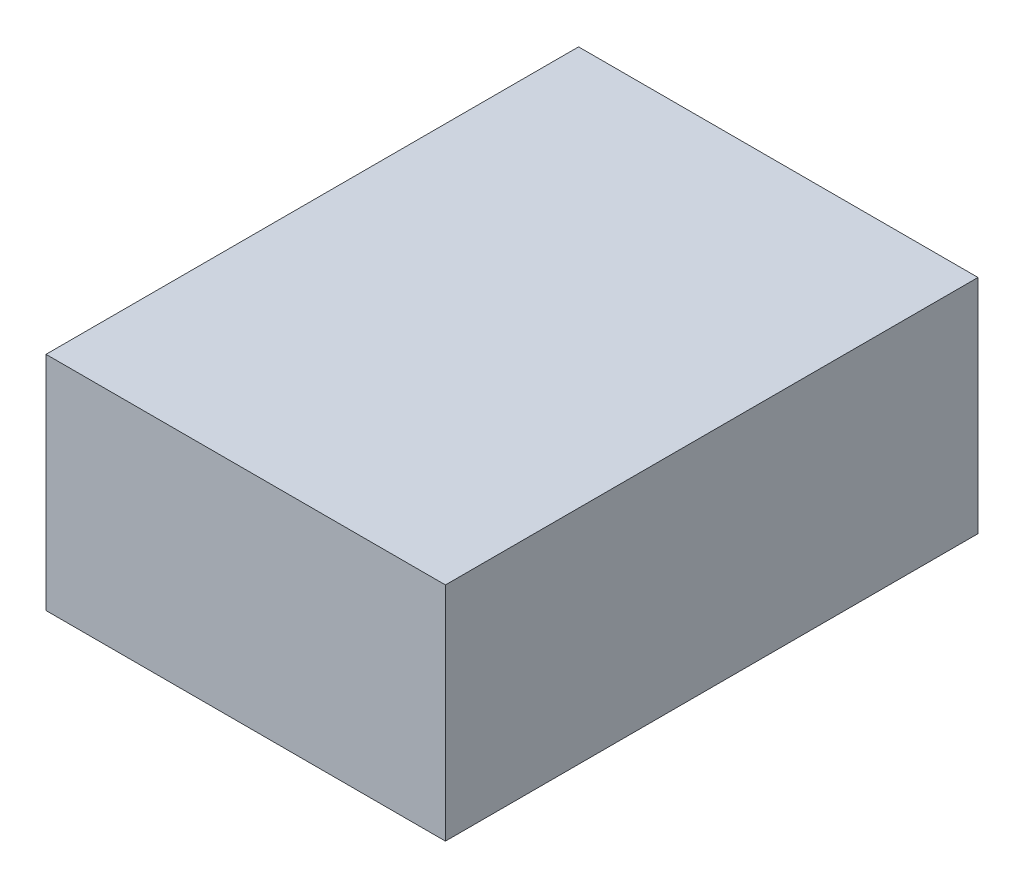
ISO-10303-21;
HEADER;
FILE_DESCRIPTION(('STEP AP214'),'2;1');
FILE_NAME('part.step','',(''),(''),'','','');
FILE_SCHEMA(('AUTOMOTIVE_DESIGN { 1 0 10303 214 1 1 1 1 }'));
ENDSEC;
DATA;
#1=APPLICATION_CONTEXT('core data for automotive mechanical design processes');
#2=APPLICATION_PROTOCOL_DEFINITION('international standard','automotive_design',2000,#1);
#3=PRODUCT_CONTEXT('',#1,'mechanical');
#4=PRODUCT('Part','Part','',(#3));
#5=PRODUCT_RELATED_PRODUCT_CATEGORY('part','',(#4));
#6=PRODUCT_DEFINITION_FORMATION('','',#4);
#7=PRODUCT_DEFINITION_CONTEXT('part definition',#1,'design');
#8=PRODUCT_DEFINITION('design','',#6,#7);
#9=PRODUCT_DEFINITION_SHAPE('','',#8);
#10=(LENGTH_UNIT() NAMED_UNIT(*) SI_UNIT(.MILLI.,.METRE.));
#11=(NAMED_UNIT(*) PLANE_ANGLE_UNIT() SI_UNIT($,.RADIAN.));
#12=(NAMED_UNIT(*) SI_UNIT($,.STERADIAN.) SOLID_ANGLE_UNIT());
#13=UNCERTAINTY_MEASURE_WITH_UNIT(LENGTH_MEASURE(1.E-05),#10,'distance_accuracy_value','');
#14=(GEOMETRIC_REPRESENTATION_CONTEXT(3) GLOBAL_UNCERTAINTY_ASSIGNED_CONTEXT((#13)) GLOBAL_UNIT_ASSIGNED_CONTEXT((#10,
#11,#12)) REPRESENTATION_CONTEXT('',''));
#15=CARTESIAN_POINT('',(0.,0.,0.));
#16=DIRECTION('',(0.,0.,1.));
#17=DIRECTION('',(1.,0.,0.));
#18=AXIS2_PLACEMENT_3D('',#15,#16,#17);
#19=CARTESIAN_POINT('',(22.5,-12.5,60.));
#20=DIRECTION('',(-1.,0.,0.));
#21=DIRECTION('',(0.,0.,1.));
#22=AXIS2_PLACEMENT_3D('',#19,#20,#21);
#23=PLANE('',#22);
#24=DIRECTION('',(0.,1.,0.));
#25=VECTOR('',#24,1.);
#26=CARTESIAN_POINT('',(22.5,-12.5,0.));
#27=LINE('',#26,#25);
#28=CARTESIAN_POINT('',(22.5,-12.5,0.));
#29=VERTEX_POINT('',#28);
#30=CARTESIAN_POINT('',(22.5,12.5,0.));
#31=VERTEX_POINT('',#30);
#32=EDGE_CURVE('E164',#29,#31,#27,.T.);
#33=ORIENTED_EDGE('',*,*,#32,.T.);
#34=DIRECTION('',(0.,0.,-1.));
#35=VECTOR('',#34,1.);
#36=CARTESIAN_POINT('',(22.5,12.5,60.));
#37=LINE('',#36,#35);
#38=CARTESIAN_POINT('',(22.5,12.5,60.));
#39=VERTEX_POINT('',#38);
#40=EDGE_CURVE('E11',#39,#31,#37,.T.);
#41=ORIENTED_EDGE('',*,*,#40,.F.);
#42=DIRECTION('',(0.,1.,0.));
#43=VECTOR('',#42,1.);
#44=CARTESIAN_POINT('',(22.5,-12.5,60.));
#45=LINE('',#44,#43);
#46=CARTESIAN_POINT('',(22.5,-12.5,60.));
#47=VERTEX_POINT('',#46);
#48=EDGE_CURVE('E170',#47,#39,#45,.T.);
#49=ORIENTED_EDGE('',*,*,#48,.F.);
#50=DIRECTION('',(0.,0.,-1.));
#51=VECTOR('',#50,1.);
#52=CARTESIAN_POINT('',(22.5,-12.5,60.));
#53=LINE('',#52,#51);
#54=EDGE_CURVE('E180',#47,#29,#53,.T.);
#55=ORIENTED_EDGE('',*,*,#54,.T.);
#56=EDGE_LOOP('',(#33,#41,#49,#55));
#57=FACE_BOUND('',#56,.T.);
#58=ADVANCED_FACE('F45',(#57),#23,.F.);
#59=CARTESIAN_POINT('',(-22.5,12.5,60.));
#60=DIRECTION('',(0.,-1.,0.));
#61=DIRECTION('',(0.,0.,-1.));
#62=AXIS2_PLACEMENT_3D('',#59,#60,#61);
#63=PLANE('',#62);
#64=DIRECTION('',(-1.,0.,0.));
#65=VECTOR('',#64,1.);
#66=CARTESIAN_POINT('',(-22.5,12.5,0.));
#67=LINE('',#66,#65);
#68=CARTESIAN_POINT('',(-22.5,12.5,0.));
#69=VERTEX_POINT('',#68);
#70=EDGE_CURVE('E184',#31,#69,#67,.T.);
#71=ORIENTED_EDGE('',*,*,#70,.T.);
#72=DIRECTION('',(0.,0.,-1.));
#73=VECTOR('',#72,1.);
#74=CARTESIAN_POINT('',(-22.5,12.5,60.));
#75=LINE('',#74,#73);
#76=CARTESIAN_POINT('',(-22.5,12.5,60.));
#77=VERTEX_POINT('',#76);
#78=EDGE_CURVE('E53',#77,#69,#75,.T.);
#79=ORIENTED_EDGE('',*,*,#78,.F.);
#80=DIRECTION('',(-1.,0.,0.));
#81=VECTOR('',#80,1.);
#82=CARTESIAN_POINT('',(-22.5,12.5,60.));
#83=LINE('',#82,#81);
#84=EDGE_CURVE('E97',#39,#77,#83,.T.);
#85=ORIENTED_EDGE('',*,*,#84,.F.);
#86=ORIENTED_EDGE('',*,*,#40,.T.);
#87=EDGE_LOOP('',(#71,#79,#85,#86));
#88=FACE_BOUND('',#87,.T.);
#89=ADVANCED_FACE('F218',(#88),#63,.F.);
#90=CARTESIAN_POINT('',(-22.5,-12.5,60.));
#91=DIRECTION('',(1.,0.,0.));
#92=DIRECTION('',(0.,0.,-1.));
#93=AXIS2_PLACEMENT_3D('',#90,#91,#92);
#94=PLANE('',#93);
#95=DIRECTION('',(0.,-1.,0.));
#96=VECTOR('',#95,1.);
#97=CARTESIAN_POINT('',(-22.5,-12.5,0.));
#98=LINE('',#97,#96);
#99=CARTESIAN_POINT('',(-22.5,-12.5,0.));
#100=VERTEX_POINT('',#99);
#101=EDGE_CURVE('E187',#69,#100,#98,.T.);
#102=ORIENTED_EDGE('',*,*,#101,.T.);
#103=DIRECTION('',(0.,0.,-1.));
#104=VECTOR('',#103,1.);
#105=CARTESIAN_POINT('',(-22.5,-12.5,60.));
#106=LINE('',#105,#104);
#107=CARTESIAN_POINT('',(-22.5,-12.5,60.));
#108=VERTEX_POINT('',#107);
#109=EDGE_CURVE('E194',#108,#100,#106,.T.);
#110=ORIENTED_EDGE('',*,*,#109,.F.);
#111=DIRECTION('',(0.,-1.,0.));
#112=VECTOR('',#111,1.);
#113=CARTESIAN_POINT('',(-22.5,-12.5,60.));
#114=LINE('',#113,#112);
#115=EDGE_CURVE('E175',#77,#108,#114,.T.);
#116=ORIENTED_EDGE('',*,*,#115,.F.);
#117=ORIENTED_EDGE('',*,*,#78,.T.);
#118=EDGE_LOOP('',(#102,#110,#116,#117));
#119=FACE_BOUND('',#118,.T.);
#120=ADVANCED_FACE('F201',(#119),#94,.F.);
#121=CARTESIAN_POINT('',(-22.5,-12.5,60.));
#122=DIRECTION('',(0.,1.,0.));
#123=DIRECTION('',(0.,0.,1.));
#124=AXIS2_PLACEMENT_3D('',#121,#122,#123);
#125=PLANE('',#124);
#126=DIRECTION('',(1.,0.,0.));
#127=VECTOR('',#126,1.);
#128=CARTESIAN_POINT('',(-22.5,-12.5,0.));
#129=LINE('',#128,#127);
#130=EDGE_CURVE('E90',#100,#29,#129,.T.);
#131=ORIENTED_EDGE('',*,*,#130,.T.);
#132=ORIENTED_EDGE('',*,*,#54,.F.);
#133=DIRECTION('',(1.,0.,0.));
#134=VECTOR('',#133,1.);
#135=CARTESIAN_POINT('',(-22.5,-12.5,60.));
#136=LINE('',#135,#134);
#137=EDGE_CURVE('E69',#108,#47,#136,.T.);
#138=ORIENTED_EDGE('',*,*,#137,.F.);
#139=ORIENTED_EDGE('',*,*,#109,.T.);
#140=EDGE_LOOP('',(#131,#132,#138,#139));
#141=FACE_BOUND('',#140,.T.);
#142=ADVANCED_FACE('F209',(#141),#125,.F.);
#143=CARTESIAN_POINT('',(0.,0.,60.));
#144=DIRECTION('',(0.,0.,-1.));
#145=DIRECTION('',(-1.,0.,0.));
#146=AXIS2_PLACEMENT_3D('',#143,#144,#145);
#147=PLANE('',#146);
#148=ORIENTED_EDGE('',*,*,#48,.T.);
#149=ORIENTED_EDGE('',*,*,#84,.T.);
#150=ORIENTED_EDGE('',*,*,#115,.T.);
#151=ORIENTED_EDGE('',*,*,#137,.T.);
#152=EDGE_LOOP('',(#148,#149,#150,#151));
#153=FACE_BOUND('',#152,.T.);
#154=ADVANCED_FACE('F211',(#153),#147,.F.);
#155=CARTESIAN_POINT('',(0.,0.,0.));
#156=DIRECTION('',(0.,0.,-1.));
#157=DIRECTION('',(-1.,0.,0.));
#158=AXIS2_PLACEMENT_3D('',#155,#156,#157);
#159=PLANE('',#158);
#160=DIRECTION('',(0.,1.,0.));
#161=VECTOR('',#160,1.);
#162=CARTESIAN_POINT('',(-21.,-11.,0.));
#163=LINE('',#162,#161);
#164=CARTESIAN_POINT('',(-21.,-11.,0.));
#165=VERTEX_POINT('',#164);
#166=CARTESIAN_POINT('',(-21.,11.,0.));
#167=VERTEX_POINT('',#166);
#168=EDGE_CURVE('E60',#165,#167,#163,.T.);
#169=ORIENTED_EDGE('',*,*,#168,.F.);
#170=DIRECTION('',(-1.,0.,0.));
#171=VECTOR('',#170,1.);
#172=CARTESIAN_POINT('',(21.,-11.,0.));
#173=LINE('',#172,#171);
#174=CARTESIAN_POINT('',(21.,-11.,0.));
#175=VERTEX_POINT('',#174);
#176=EDGE_CURVE('E142',#175,#165,#173,.T.);
#177=ORIENTED_EDGE('',*,*,#176,.F.);
#178=DIRECTION('',(0.,-1.,0.));
#179=VECTOR('',#178,1.);
#180=CARTESIAN_POINT('',(21.,-11.,0.));
#181=LINE('',#180,#179);
#182=CARTESIAN_POINT('',(21.,11.,0.));
#183=VERTEX_POINT('',#182);
#184=EDGE_CURVE('E146',#183,#175,#181,.T.);
#185=ORIENTED_EDGE('',*,*,#184,.F.);
#186=DIRECTION('',(1.,0.,0.));
#187=VECTOR('',#186,1.);
#188=CARTESIAN_POINT('',(21.,11.,0.));
#189=LINE('',#188,#187);
#190=EDGE_CURVE('E155',#167,#183,#189,.T.);
#191=ORIENTED_EDGE('',*,*,#190,.F.);
#192=EDGE_LOOP('',(#169,#177,#185,#191));
#193=FACE_BOUND('',#192,.T.);
#194=ORIENTED_EDGE('',*,*,#32,.F.);
#195=ORIENTED_EDGE('',*,*,#130,.F.);
#196=ORIENTED_EDGE('',*,*,#101,.F.);
#197=ORIENTED_EDGE('',*,*,#70,.F.);
#198=EDGE_LOOP('',(#194,#195,#196,#197));
#199=FACE_BOUND('',#198,.T.);
#200=ADVANCED_FACE('F205',(#193,#199),#159,.T.);
#201=CARTESIAN_POINT('',(-21.,-11.,11.));
#202=DIRECTION('',(-1.,0.,0.));
#203=DIRECTION('',(0.,0.,1.));
#204=AXIS2_PLACEMENT_3D('',#201,#202,#203);
#205=PLANE('',#204);
#206=ORIENTED_EDGE('',*,*,#168,.T.);
#207=DIRECTION('',(0.,0.,-1.));
#208=VECTOR('',#207,1.);
#209=CARTESIAN_POINT('',(-21.,11.,11.));
#210=LINE('',#209,#208);
#211=CARTESIAN_POINT('',(-21.,11.,11.));
#212=VERTEX_POINT('',#211);
#213=EDGE_CURVE('E117',#212,#167,#210,.T.);
#214=ORIENTED_EDGE('',*,*,#213,.F.);
#215=DIRECTION('',(0.,1.,0.));
#216=VECTOR('',#215,1.);
#217=CARTESIAN_POINT('',(-21.,-11.,11.));
#218=LINE('',#217,#216);
#219=CARTESIAN_POINT('',(-21.,-11.,11.));
#220=VERTEX_POINT('',#219);
#221=EDGE_CURVE('E121',#220,#212,#218,.T.);
#222=ORIENTED_EDGE('',*,*,#221,.F.);
#223=DIRECTION('',(0.,0.,-1.));
#224=VECTOR('',#223,1.);
#225=CARTESIAN_POINT('',(-21.,-11.,11.));
#226=LINE('',#225,#224);
#227=EDGE_CURVE('E161',#220,#165,#226,.T.);
#228=ORIENTED_EDGE('',*,*,#227,.T.);
#229=EDGE_LOOP('',(#206,#214,#222,#228));
#230=FACE_BOUND('',#229,.T.);
#231=ADVANCED_FACE('F119',(#230),#205,.F.);
#232=CARTESIAN_POINT('',(21.,-11.,11.));
#233=DIRECTION('',(0.,-1.,0.));
#234=DIRECTION('',(0.,0.,-1.));
#235=AXIS2_PLACEMENT_3D('',#232,#233,#234);
#236=PLANE('',#235);
#237=ORIENTED_EDGE('',*,*,#176,.T.);
#238=ORIENTED_EDGE('',*,*,#227,.F.);
#239=DIRECTION('',(-1.,0.,0.));
#240=VECTOR('',#239,1.);
#241=CARTESIAN_POINT('',(21.,-11.,11.));
#242=LINE('',#241,#240);
#243=CARTESIAN_POINT('',(21.,-11.,11.));
#244=VERTEX_POINT('',#243);
#245=EDGE_CURVE('E128',#244,#220,#242,.T.);
#246=ORIENTED_EDGE('',*,*,#245,.F.);
#247=DIRECTION('',(0.,0.,-1.));
#248=VECTOR('',#247,1.);
#249=CARTESIAN_POINT('',(21.,-11.,11.));
#250=LINE('',#249,#248);
#251=EDGE_CURVE('E165',#244,#175,#250,.T.);
#252=ORIENTED_EDGE('',*,*,#251,.T.);
#253=EDGE_LOOP('',(#237,#238,#246,#252));
#254=FACE_BOUND('',#253,.T.);
#255=ADVANCED_FACE('F260',(#254),#236,.F.);
#256=CARTESIAN_POINT('',(21.,-11.,11.));
#257=DIRECTION('',(1.,0.,0.));
#258=DIRECTION('',(0.,0.,-1.));
#259=AXIS2_PLACEMENT_3D('',#256,#257,#258);
#260=PLANE('',#259);
#261=ORIENTED_EDGE('',*,*,#184,.T.);
#262=ORIENTED_EDGE('',*,*,#251,.F.);
#263=DIRECTION('',(0.,-1.,0.));
#264=VECTOR('',#263,1.);
#265=CARTESIAN_POINT('',(21.,-11.,11.));
#266=LINE('',#265,#264);
#267=CARTESIAN_POINT('',(21.,11.,11.));
#268=VERTEX_POINT('',#267);
#269=EDGE_CURVE('E137',#268,#244,#266,.T.);
#270=ORIENTED_EDGE('',*,*,#269,.F.);
#271=DIRECTION('',(0.,0.,-1.));
#272=VECTOR('',#271,1.);
#273=CARTESIAN_POINT('',(21.,11.,11.));
#274=LINE('',#273,#272);
#275=EDGE_CURVE('E127',#268,#183,#274,.T.);
#276=ORIENTED_EDGE('',*,*,#275,.T.);
#277=EDGE_LOOP('',(#261,#262,#270,#276));
#278=FACE_BOUND('',#277,.T.);
#279=ADVANCED_FACE('F269',(#278),#260,.F.);
#280=CARTESIAN_POINT('',(21.,11.,11.));
#281=DIRECTION('',(0.,1.,0.));
#282=DIRECTION('',(0.,0.,1.));
#283=AXIS2_PLACEMENT_3D('',#280,#281,#282);
#284=PLANE('',#283);
#285=ORIENTED_EDGE('',*,*,#190,.T.);
#286=ORIENTED_EDGE('',*,*,#275,.F.);
#287=DIRECTION('',(1.,0.,0.));
#288=VECTOR('',#287,1.);
#289=CARTESIAN_POINT('',(21.,11.,11.));
#290=LINE('',#289,#288);
#291=EDGE_CURVE('E131',#212,#268,#290,.T.);
#292=ORIENTED_EDGE('',*,*,#291,.F.);
#293=ORIENTED_EDGE('',*,*,#213,.T.);
#294=EDGE_LOOP('',(#285,#286,#292,#293));
#295=FACE_BOUND('',#294,.T.);
#296=ADVANCED_FACE('F132',(#295),#284,.F.);
#297=CARTESIAN_POINT('',(0.,0.,11.));
#298=DIRECTION('',(0.,0.,1.));
#299=DIRECTION('',(1.,0.,0.));
#300=AXIS2_PLACEMENT_3D('',#297,#298,#299);
#301=PLANE('',#300);
#302=ORIENTED_EDGE('',*,*,#221,.T.);
#303=ORIENTED_EDGE('',*,*,#291,.T.);
#304=ORIENTED_EDGE('',*,*,#269,.T.);
#305=ORIENTED_EDGE('',*,*,#245,.T.);
#306=EDGE_LOOP('',(#302,#303,#304,#305));
#307=FACE_BOUND('',#306,.T.);
#308=ADVANCED_FACE('F139',(#307),#301,.F.);
#309=CLOSED_SHELL('',(#58,#89,#120,#142,#154,#200,#231,#255,#279,#296,#308));
#310=MANIFOLD_SOLID_BREP('B2',#309);
#311=ADVANCED_BREP_SHAPE_REPRESENTATION('',(#18,#310),#14);
#312=SHAPE_DEFINITION_REPRESENTATION(#9,#311);
ENDSEC;
END-ISO-10303-21;
